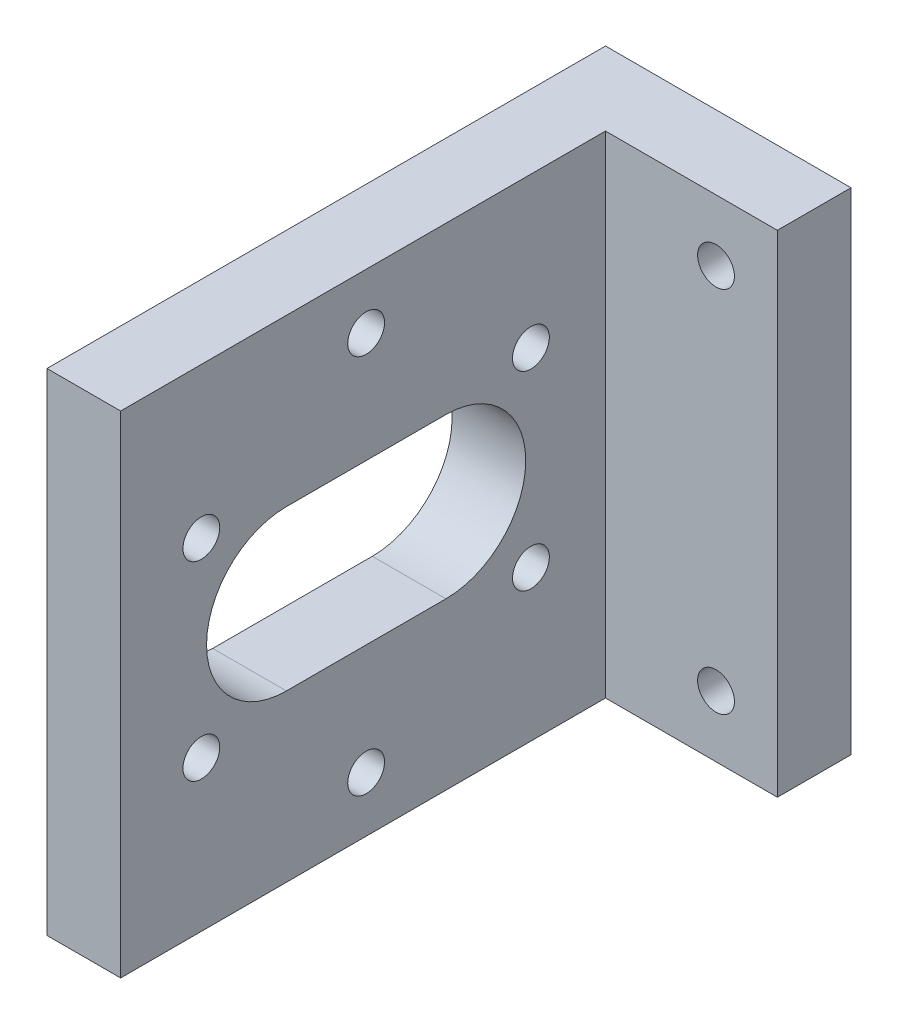
ISO-10303-21;
HEADER;
FILE_DESCRIPTION(('STEP AP214'),'2;1');
FILE_NAME('part.step','',(''),(''),'','','');
FILE_SCHEMA(('AUTOMOTIVE_DESIGN { 1 0 10303 214 1 1 1 1 }'));
ENDSEC;
DATA;
#1=APPLICATION_CONTEXT('core data for automotive mechanical design processes');
#2=APPLICATION_PROTOCOL_DEFINITION('international standard','automotive_design',2000,#1);
#3=PRODUCT_CONTEXT('',#1,'mechanical');
#4=PRODUCT('Part','Part','',(#3));
#5=PRODUCT_RELATED_PRODUCT_CATEGORY('part','',(#4));
#6=PRODUCT_DEFINITION_FORMATION('','',#4);
#7=PRODUCT_DEFINITION_CONTEXT('part definition',#1,'design');
#8=PRODUCT_DEFINITION('design','',#6,#7);
#9=PRODUCT_DEFINITION_SHAPE('','',#8);
#10=(LENGTH_UNIT() NAMED_UNIT(*) SI_UNIT(.MILLI.,.METRE.));
#11=(NAMED_UNIT(*) PLANE_ANGLE_UNIT() SI_UNIT($,.RADIAN.));
#12=(NAMED_UNIT(*) SI_UNIT($,.STERADIAN.) SOLID_ANGLE_UNIT());
#13=UNCERTAINTY_MEASURE_WITH_UNIT(LENGTH_MEASURE(1.E-05),#10,'distance_accuracy_value','');
#14=(GEOMETRIC_REPRESENTATION_CONTEXT(3) GLOBAL_UNCERTAINTY_ASSIGNED_CONTEXT((#13)) GLOBAL_UNIT_ASSIGNED_CONTEXT((#10,
#11,#12)) REPRESENTATION_CONTEXT('',''));
#15=CARTESIAN_POINT('',(0.,0.,0.));
#16=DIRECTION('',(0.,0.,1.));
#17=DIRECTION('',(1.,0.,0.));
#18=AXIS2_PLACEMENT_3D('',#15,#16,#17);
#19=CARTESIAN_POINT('',(0.,7.75,11.076606241341));
#20=DIRECTION('',(-1.,0.,0.));
#21=DIRECTION('',(0.,1.,0.));
#22=AXIS2_PLACEMENT_3D('',#19,#20,#21);
#23=CYLINDRICAL_SURFACE('',#22,1.5);
#24=DIRECTION('',(1.,0.,0.));
#25=VECTOR('',#24,1.);
#26=CARTESIAN_POINT('',(0.,9.25,11.076606241341));
#27=LINE('',#26,#25);
#28=CARTESIAN_POINT('',(0.,9.25,11.076606241341));
#29=VERTEX_POINT('',#28);
#30=CARTESIAN_POINT('',(1.,9.25,11.076606241341));
#31=VERTEX_POINT('',#30);
#32=EDGE_CURVE('E13',#29,#31,#27,.T.);
#33=ORIENTED_EDGE('',*,*,#32,.F.);
#34=ORIENTED_EDGE('',*,*,#32,.T.);
#35=CARTESIAN_POINT('',(1.,7.75,11.076606241341));
#36=DIRECTION('',(-1.,0.,0.));
#37=DIRECTION('',(0.,1.,0.));
#38=AXIS2_PLACEMENT_3D('',#35,#36,#37);
#39=CIRCLE('',#38,1.5);
#40=EDGE_CURVE('E311',#31,#31,#39,.T.);
#41=ORIENTED_EDGE('',*,*,#40,.F.);
#42=EDGE_LOOP('',(#33,#34,#41));
#43=FACE_BOUND('',#42,.T.);
#44=CARTESIAN_POINT('',(-5.,7.75,11.076606241341));
#45=DIRECTION('',(-1.,0.,0.));
#46=DIRECTION('',(0.,0.,1.));
#47=AXIS2_PLACEMENT_3D('',#44,#45,#46);
#48=CIRCLE('',#47,1.5);
#49=CARTESIAN_POINT('',(-5.,7.75,12.576606241341));
#50=VERTEX_POINT('',#49);
#51=EDGE_CURVE('E253',#50,#50,#48,.T.);
#52=ORIENTED_EDGE('',*,*,#51,.T.);
#53=EDGE_LOOP('',(#52));
#54=FACE_BOUND('',#53,.T.);
#55=ADVANCED_FACE('F60',(#43,#54),#23,.F.);
#56=CARTESIAN_POINT('',(0.,15.5,24.5));
#57=DIRECTION('',(-1.,0.,0.));
#58=DIRECTION('',(0.,1.,0.));
#59=AXIS2_PLACEMENT_3D('',#56,#57,#58);
#60=CYLINDRICAL_SURFACE('',#59,1.5);
#61=DIRECTION('',(1.,0.,0.));
#62=VECTOR('',#61,1.);
#63=CARTESIAN_POINT('',(0.,17.,24.5));
#64=LINE('',#63,#62);
#65=CARTESIAN_POINT('',(0.,17.,24.5));
#66=VERTEX_POINT('',#65);
#67=CARTESIAN_POINT('',(1.,17.,24.5));
#68=VERTEX_POINT('',#67);
#69=EDGE_CURVE('E69',#66,#68,#64,.T.);
#70=ORIENTED_EDGE('',*,*,#69,.F.);
#71=ORIENTED_EDGE('',*,*,#69,.T.);
#72=CARTESIAN_POINT('',(1.,15.5,24.5));
#73=DIRECTION('',(-1.,0.,0.));
#74=DIRECTION('',(0.,1.,0.));
#75=AXIS2_PLACEMENT_3D('',#72,#73,#74);
#76=CIRCLE('',#75,1.5);
#77=EDGE_CURVE('E320',#68,#68,#76,.T.);
#78=ORIENTED_EDGE('',*,*,#77,.F.);
#79=EDGE_LOOP('',(#70,#71,#78));
#80=FACE_BOUND('',#79,.T.);
#81=CARTESIAN_POINT('',(-5.,15.5,24.5));
#82=DIRECTION('',(-1.,0.,0.));
#83=DIRECTION('',(0.,0.,1.));
#84=AXIS2_PLACEMENT_3D('',#81,#82,#83);
#85=CIRCLE('',#84,1.5);
#86=CARTESIAN_POINT('',(-5.,15.5,26.));
#87=VERTEX_POINT('',#86);
#88=EDGE_CURVE('E256',#87,#87,#85,.T.);
#89=ORIENTED_EDGE('',*,*,#88,.T.);
#90=EDGE_LOOP('',(#89));
#91=FACE_BOUND('',#90,.T.);
#92=ADVANCED_FACE('F370',(#80,#91),#60,.F.);
#93=CARTESIAN_POINT('',(0.,6.5,18.));
#94=DIRECTION('',(0.,-1.,0.));
#95=DIRECTION('',(-1.,0.,0.));
#96=AXIS2_PLACEMENT_3D('',#93,#94,#95);
#97=PLANE('',#96);
#98=DIRECTION('',(1.,0.,0.));
#99=VECTOR('',#98,1.);
#100=CARTESIAN_POINT('',(0.,6.5,31.));
#101=LINE('',#100,#99);
#102=CARTESIAN_POINT('',(-5.,6.5,31.));
#103=VERTEX_POINT('',#102);
#104=CARTESIAN_POINT('',(1.,6.5,31.));
#105=VERTEX_POINT('',#104);
#106=EDGE_CURVE('E317',#103,#105,#101,.T.);
#107=ORIENTED_EDGE('',*,*,#106,.F.);
#108=DIRECTION('',(0.,0.,-1.));
#109=VECTOR('',#108,1.);
#110=CARTESIAN_POINT('',(-5.,6.5,18.));
#111=LINE('',#110,#109);
#112=CARTESIAN_POINT('',(-5.,6.5,18.));
#113=VERTEX_POINT('',#112);
#114=EDGE_CURVE('E268',#103,#113,#111,.T.);
#115=ORIENTED_EDGE('',*,*,#114,.T.);
#116=DIRECTION('',(1.,0.,0.));
#117=VECTOR('',#116,1.);
#118=CARTESIAN_POINT('',(0.,6.5,18.));
#119=LINE('',#118,#117);
#120=CARTESIAN_POINT('',(1.,6.5,18.));
#121=VERTEX_POINT('',#120);
#122=EDGE_CURVE('E285',#113,#121,#119,.T.);
#123=ORIENTED_EDGE('',*,*,#122,.T.);
#124=DIRECTION('',(0.,0.,1.));
#125=VECTOR('',#124,1.);
#126=CARTESIAN_POINT('',(1.,6.5,9.));
#127=LINE('',#126,#125);
#128=EDGE_CURVE('E290',#121,#105,#127,.T.);
#129=ORIENTED_EDGE('',*,*,#128,.T.);
#130=EDGE_LOOP('',(#107,#115,#123,#129));
#131=FACE_BOUND('',#130,.T.);
#132=ADVANCED_FACE('F376',(#131),#97,.T.);
#133=CARTESIAN_POINT('',(0.,7.75,37.923393758659));
#134=DIRECTION('',(-1.,0.,0.));
#135=DIRECTION('',(0.,1.,0.));
#136=AXIS2_PLACEMENT_3D('',#133,#134,#135);
#137=CYLINDRICAL_SURFACE('',#136,1.5);
#138=DIRECTION('',(1.,0.,0.));
#139=VECTOR('',#138,1.);
#140=CARTESIAN_POINT('',(0.,9.25,37.923393758659));
#141=LINE('',#140,#139);
#142=CARTESIAN_POINT('',(0.,9.25,37.923393758659));
#143=VERTEX_POINT('',#142);
#144=CARTESIAN_POINT('',(1.,9.25,37.923393758659));
#145=VERTEX_POINT('',#144);
#146=EDGE_CURVE('E335',#143,#145,#141,.T.);
#147=ORIENTED_EDGE('',*,*,#146,.F.);
#148=ORIENTED_EDGE('',*,*,#146,.T.);
#149=CARTESIAN_POINT('',(1.,7.75,37.923393758659));
#150=DIRECTION('',(-1.,0.,0.));
#151=DIRECTION('',(0.,1.,0.));
#152=AXIS2_PLACEMENT_3D('',#149,#150,#151);
#153=CIRCLE('',#152,1.5);
#154=EDGE_CURVE('E289',#145,#145,#153,.T.);
#155=ORIENTED_EDGE('',*,*,#154,.F.);
#156=EDGE_LOOP('',(#147,#148,#155));
#157=FACE_BOUND('',#156,.T.);
#158=CARTESIAN_POINT('',(-5.,7.75,37.923393758659));
#159=DIRECTION('',(-1.,0.,0.));
#160=DIRECTION('',(0.,0.,1.));
#161=AXIS2_PLACEMENT_3D('',#158,#159,#160);
#162=CIRCLE('',#161,1.5);
#163=CARTESIAN_POINT('',(-5.,7.75,39.423393758659));
#164=VERTEX_POINT('',#163);
#165=EDGE_CURVE('E259',#164,#164,#162,.T.);
#166=ORIENTED_EDGE('',*,*,#165,.T.);
#167=EDGE_LOOP('',(#166));
#168=FACE_BOUND('',#167,.T.);
#169=ADVANCED_FACE('F387',(#157,#168),#137,.F.);
#170=CARTESIAN_POINT('',(0.,-7.75,11.076606241341));
#171=DIRECTION('',(-1.,0.,0.));
#172=DIRECTION('',(0.,1.,0.));
#173=AXIS2_PLACEMENT_3D('',#170,#171,#172);
#174=CYLINDRICAL_SURFACE('',#173,1.5);
#175=DIRECTION('',(1.,0.,0.));
#176=VECTOR('',#175,1.);
#177=CARTESIAN_POINT('',(0.,-6.25,11.076606241341));
#178=LINE('',#177,#176);
#179=CARTESIAN_POINT('',(0.,-6.25,11.076606241341));
#180=VERTEX_POINT('',#179);
#181=CARTESIAN_POINT('',(1.,-6.25,11.076606241341));
#182=VERTEX_POINT('',#181);
#183=EDGE_CURVE('E333',#180,#182,#178,.T.);
#184=ORIENTED_EDGE('',*,*,#183,.F.);
#185=ORIENTED_EDGE('',*,*,#183,.T.);
#186=CARTESIAN_POINT('',(1.,-7.75,11.076606241341));
#187=DIRECTION('',(-1.,0.,0.));
#188=DIRECTION('',(0.,1.,0.));
#189=AXIS2_PLACEMENT_3D('',#186,#187,#188);
#190=CIRCLE('',#189,1.5);
#191=EDGE_CURVE('E307',#182,#182,#190,.T.);
#192=ORIENTED_EDGE('',*,*,#191,.F.);
#193=EDGE_LOOP('',(#184,#185,#192));
#194=FACE_BOUND('',#193,.T.);
#195=CARTESIAN_POINT('',(-5.,-7.75,11.076606241341));
#196=DIRECTION('',(-1.,0.,0.));
#197=DIRECTION('',(0.,0.,1.));
#198=AXIS2_PLACEMENT_3D('',#195,#196,#197);
#199=CIRCLE('',#198,1.5);
#200=CARTESIAN_POINT('',(-5.,-7.75,12.576606241341));
#201=VERTEX_POINT('',#200);
#202=EDGE_CURVE('E244',#201,#201,#199,.T.);
#203=ORIENTED_EDGE('',*,*,#202,.T.);
#204=EDGE_LOOP('',(#203));
#205=FACE_BOUND('',#204,.T.);
#206=ADVANCED_FACE('F390',(#194,#205),#174,.F.);
#207=CARTESIAN_POINT('',(0.,-15.5,24.5));
#208=DIRECTION('',(-1.,0.,0.));
#209=DIRECTION('',(0.,1.,0.));
#210=AXIS2_PLACEMENT_3D('',#207,#208,#209);
#211=CYLINDRICAL_SURFACE('',#210,1.5);
#212=DIRECTION('',(1.,0.,0.));
#213=VECTOR('',#212,1.);
#214=CARTESIAN_POINT('',(0.,-14.,24.5));
#215=LINE('',#214,#213);
#216=CARTESIAN_POINT('',(0.,-14.,24.5));
#217=VERTEX_POINT('',#216);
#218=CARTESIAN_POINT('',(1.,-14.,24.5));
#219=VERTEX_POINT('',#218);
#220=EDGE_CURVE('E64',#217,#219,#215,.T.);
#221=ORIENTED_EDGE('',*,*,#220,.F.);
#222=ORIENTED_EDGE('',*,*,#220,.T.);
#223=CARTESIAN_POINT('',(1.,-15.5,24.5));
#224=DIRECTION('',(-1.,0.,0.));
#225=DIRECTION('',(0.,1.,0.));
#226=AXIS2_PLACEMENT_3D('',#223,#224,#225);
#227=CIRCLE('',#226,1.5);
#228=EDGE_CURVE('E286',#219,#219,#227,.T.);
#229=ORIENTED_EDGE('',*,*,#228,.F.);
#230=EDGE_LOOP('',(#221,#222,#229));
#231=FACE_BOUND('',#230,.T.);
#232=CARTESIAN_POINT('',(-5.,-15.5,24.5));
#233=DIRECTION('',(-1.,0.,0.));
#234=DIRECTION('',(0.,0.,1.));
#235=AXIS2_PLACEMENT_3D('',#232,#233,#234);
#236=CIRCLE('',#235,1.5);
#237=CARTESIAN_POINT('',(-5.,-15.5,26.));
#238=VERTEX_POINT('',#237);
#239=EDGE_CURVE('E247',#238,#238,#236,.T.);
#240=ORIENTED_EDGE('',*,*,#239,.T.);
#241=EDGE_LOOP('',(#240));
#242=FACE_BOUND('',#241,.T.);
#243=ADVANCED_FACE('F62',(#231,#242),#211,.F.);
#244=CARTESIAN_POINT('',(0.,-7.75,37.923393758659));
#245=DIRECTION('',(-1.,0.,0.));
#246=DIRECTION('',(0.,1.,0.));
#247=AXIS2_PLACEMENT_3D('',#244,#245,#246);
#248=CYLINDRICAL_SURFACE('',#247,1.5);
#249=DIRECTION('',(1.,0.,0.));
#250=VECTOR('',#249,1.);
#251=CARTESIAN_POINT('',(0.,-6.25,37.923393758659));
#252=LINE('',#251,#250);
#253=CARTESIAN_POINT('',(0.,-6.25,37.923393758659));
#254=VERTEX_POINT('',#253);
#255=CARTESIAN_POINT('',(1.,-6.25,37.923393758659));
#256=VERTEX_POINT('',#255);
#257=EDGE_CURVE('E283',#254,#256,#252,.T.);
#258=ORIENTED_EDGE('',*,*,#257,.F.);
#259=ORIENTED_EDGE('',*,*,#257,.T.);
#260=CARTESIAN_POINT('',(1.,-7.75,37.923393758659));
#261=DIRECTION('',(-1.,0.,0.));
#262=DIRECTION('',(0.,1.,0.));
#263=AXIS2_PLACEMENT_3D('',#260,#261,#262);
#264=CIRCLE('',#263,1.5);
#265=EDGE_CURVE('E203',#256,#256,#264,.T.);
#266=ORIENTED_EDGE('',*,*,#265,.F.);
#267=EDGE_LOOP('',(#258,#259,#266));
#268=FACE_BOUND('',#267,.T.);
#269=CARTESIAN_POINT('',(-5.,-7.75,37.923393758659));
#270=DIRECTION('',(-1.,0.,0.));
#271=DIRECTION('',(0.,0.,1.));
#272=AXIS2_PLACEMENT_3D('',#269,#270,#271);
#273=CIRCLE('',#272,1.5);
#274=CARTESIAN_POINT('',(-5.,-7.75,39.423393758659));
#275=VERTEX_POINT('',#274);
#276=EDGE_CURVE('E250',#275,#275,#273,.T.);
#277=ORIENTED_EDGE('',*,*,#276,.T.);
#278=EDGE_LOOP('',(#277));
#279=FACE_BOUND('',#278,.T.);
#280=ADVANCED_FACE('F411',(#268,#279),#248,.F.);
#281=CARTESIAN_POINT('',(0.,0.,18.));
#282=DIRECTION('',(-1.,0.,0.));
#283=DIRECTION('',(0.,1.,0.));
#284=AXIS2_PLACEMENT_3D('',#281,#282,#283);
#285=CYLINDRICAL_SURFACE('',#284,6.5);
#286=ORIENTED_EDGE('',*,*,#122,.F.);
#287=CARTESIAN_POINT('',(-5.,0.,18.));
#288=DIRECTION('',(-1.,0.,0.));
#289=DIRECTION('',(0.,0.,1.));
#290=AXIS2_PLACEMENT_3D('',#287,#288,#289);
#291=CIRCLE('',#290,6.5);
#292=CARTESIAN_POINT('',(-5.,-6.5,18.));
#293=VERTEX_POINT('',#292);
#294=EDGE_CURVE('E265',#113,#293,#291,.T.);
#295=ORIENTED_EDGE('',*,*,#294,.T.);
#296=DIRECTION('',(1.,0.,0.));
#297=VECTOR('',#296,1.);
#298=CARTESIAN_POINT('',(0.,-6.5,18.));
#299=LINE('',#298,#297);
#300=CARTESIAN_POINT('',(1.,-6.5,18.));
#301=VERTEX_POINT('',#300);
#302=EDGE_CURVE('E300',#293,#301,#299,.T.);
#303=ORIENTED_EDGE('',*,*,#302,.T.);
#304=CARTESIAN_POINT('',(1.,0.,18.));
#305=DIRECTION('',(-1.,0.,0.));
#306=DIRECTION('',(0.,1.,0.));
#307=AXIS2_PLACEMENT_3D('',#304,#305,#306);
#308=CIRCLE('',#307,6.5);
#309=EDGE_CURVE('E293',#121,#301,#308,.T.);
#310=ORIENTED_EDGE('',*,*,#309,.F.);
#311=EDGE_LOOP('',(#286,#295,#303,#310));
#312=FACE_BOUND('',#311,.T.);
#313=ADVANCED_FACE('F406',(#312),#285,.F.);
#314=CARTESIAN_POINT('',(0.,-6.5,18.));
#315=DIRECTION('',(0.,-1.,0.));
#316=DIRECTION('',(-1.,0.,0.));
#317=AXIS2_PLACEMENT_3D('',#314,#315,#316);
#318=PLANE('',#317);
#319=DIRECTION('',(1.,0.,0.));
#320=VECTOR('',#319,1.);
#321=CARTESIAN_POINT('',(0.,-6.5,31.));
#322=LINE('',#321,#320);
#323=CARTESIAN_POINT('',(-5.,-6.5,31.));
#324=VERTEX_POINT('',#323);
#325=CARTESIAN_POINT('',(1.,-6.5,31.));
#326=VERTEX_POINT('',#325);
#327=EDGE_CURVE('E302',#324,#326,#322,.T.);
#328=ORIENTED_EDGE('',*,*,#327,.T.);
#329=DIRECTION('',(0.,0.,1.));
#330=VECTOR('',#329,1.);
#331=CARTESIAN_POINT('',(1.,-6.5,9.));
#332=LINE('',#331,#330);
#333=EDGE_CURVE('E326',#301,#326,#332,.T.);
#334=ORIENTED_EDGE('',*,*,#333,.F.);
#335=ORIENTED_EDGE('',*,*,#302,.F.);
#336=DIRECTION('',(0.,0.,1.));
#337=VECTOR('',#336,1.);
#338=CARTESIAN_POINT('',(-5.,-6.5,31.));
#339=LINE('',#338,#337);
#340=EDGE_CURVE('E262',#293,#324,#339,.T.);
#341=ORIENTED_EDGE('',*,*,#340,.T.);
#342=EDGE_LOOP('',(#328,#334,#335,#341));
#343=FACE_BOUND('',#342,.T.);
#344=ADVANCED_FACE('F397',(#343),#318,.F.);
#345=CARTESIAN_POINT('',(0.,0.,31.));
#346=DIRECTION('',(-1.,0.,0.));
#347=DIRECTION('',(0.,1.,0.));
#348=AXIS2_PLACEMENT_3D('',#345,#346,#347);
#349=CYLINDRICAL_SURFACE('',#348,6.5);
#350=CARTESIAN_POINT('',(-5.,0.,31.));
#351=DIRECTION('',(-1.,0.,0.));
#352=DIRECTION('',(0.,0.,1.));
#353=AXIS2_PLACEMENT_3D('',#350,#351,#352);
#354=CIRCLE('',#353,6.5);
#355=EDGE_CURVE('E271',#324,#103,#354,.T.);
#356=ORIENTED_EDGE('',*,*,#355,.T.);
#357=ORIENTED_EDGE('',*,*,#106,.T.);
#358=CARTESIAN_POINT('',(1.,0.,31.));
#359=DIRECTION('',(-1.,0.,0.));
#360=DIRECTION('',(0.,1.,0.));
#361=AXIS2_PLACEMENT_3D('',#358,#359,#360);
#362=CIRCLE('',#361,6.5);
#363=EDGE_CURVE('E294',#326,#105,#362,.T.);
#364=ORIENTED_EDGE('',*,*,#363,.F.);
#365=ORIENTED_EDGE('',*,*,#327,.F.);
#366=EDGE_LOOP('',(#356,#357,#364,#365));
#367=FACE_BOUND('',#366,.T.);
#368=ADVANCED_FACE('F394',(#367),#349,.F.);
#369=CARTESIAN_POINT('',(10.,15.000000000005,0.));
#370=DIRECTION('',(0.,0.,1.));
#371=DIRECTION('',(1.,0.,0.));
#372=AXIS2_PLACEMENT_3D('',#369,#370,#371);
#373=CYLINDRICAL_SURFACE('',#372,1.5);
#374=DIRECTION('',(0.,0.,-1.));
#375=VECTOR('',#374,1.);
#376=CARTESIAN_POINT('',(11.5,15.000000000005,0.));
#377=LINE('',#376,#375);
#378=CARTESIAN_POINT('',(11.5,15.000000000005,0.));
#379=VERTEX_POINT('',#378);
#380=CARTESIAN_POINT('',(11.5,15.000000000005,-1.));
#381=VERTEX_POINT('',#380);
#382=EDGE_CURVE('E310',#379,#381,#377,.T.);
#383=ORIENTED_EDGE('',*,*,#382,.F.);
#384=ORIENTED_EDGE('',*,*,#382,.T.);
#385=CARTESIAN_POINT('',(10.,15.000000000005,-1.));
#386=DIRECTION('',(0.,0.,1.));
#387=DIRECTION('',(1.,0.,0.));
#388=AXIS2_PLACEMENT_3D('',#385,#386,#387);
#389=CIRCLE('',#388,1.5);
#390=EDGE_CURVE('E298',#381,#381,#389,.T.);
#391=ORIENTED_EDGE('',*,*,#390,.F.);
#392=EDGE_LOOP('',(#383,#384,#391));
#393=FACE_BOUND('',#392,.T.);
#394=CARTESIAN_POINT('',(10.,15.000000000005,5.));
#395=DIRECTION('',(0.,0.,1.));
#396=DIRECTION('',(1.,0.,0.));
#397=AXIS2_PLACEMENT_3D('',#394,#395,#396);
#398=CIRCLE('',#397,1.5);
#399=CARTESIAN_POINT('',(11.5,15.000000000005,5.));
#400=VERTEX_POINT('',#399);
#401=EDGE_CURVE('E228',#400,#400,#398,.T.);
#402=ORIENTED_EDGE('',*,*,#401,.T.);
#403=EDGE_LOOP('',(#402));
#404=FACE_BOUND('',#403,.T.);
#405=ADVANCED_FACE('F382',(#393,#404),#373,.F.);
#406=CARTESIAN_POINT('',(10.,-14.99999999999,0.));
#407=DIRECTION('',(0.,0.,1.));
#408=DIRECTION('',(1.,0.,0.));
#409=AXIS2_PLACEMENT_3D('',#406,#407,#408);
#410=CYLINDRICAL_SURFACE('',#409,1.5);
#411=DIRECTION('',(0.,0.,-1.));
#412=VECTOR('',#411,1.);
#413=CARTESIAN_POINT('',(11.5,-14.99999999999,0.));
#414=LINE('',#413,#412);
#415=CARTESIAN_POINT('',(11.5,-14.99999999999,0.));
#416=VERTEX_POINT('',#415);
#417=CARTESIAN_POINT('',(11.5,-14.99999999999,-1.));
#418=VERTEX_POINT('',#417);
#419=EDGE_CURVE('E308',#416,#418,#414,.T.);
#420=ORIENTED_EDGE('',*,*,#419,.F.);
#421=ORIENTED_EDGE('',*,*,#419,.T.);
#422=CARTESIAN_POINT('',(10.,-14.99999999999,-1.));
#423=DIRECTION('',(0.,0.,1.));
#424=DIRECTION('',(1.,0.,0.));
#425=AXIS2_PLACEMENT_3D('',#422,#423,#424);
#426=CIRCLE('',#425,1.5);
#427=EDGE_CURVE('E295',#418,#418,#426,.T.);
#428=ORIENTED_EDGE('',*,*,#427,.F.);
#429=EDGE_LOOP('',(#420,#421,#428));
#430=FACE_BOUND('',#429,.T.);
#431=CARTESIAN_POINT('',(10.,-14.99999999999,5.));
#432=DIRECTION('',(0.,0.,1.));
#433=DIRECTION('',(1.,0.,0.));
#434=AXIS2_PLACEMENT_3D('',#431,#432,#433);
#435=CIRCLE('',#434,1.5);
#436=CARTESIAN_POINT('',(11.5,-14.99999999999,5.));
#437=VERTEX_POINT('',#436);
#438=EDGE_CURVE('E227',#437,#437,#435,.T.);
#439=ORIENTED_EDGE('',*,*,#438,.T.);
#440=EDGE_LOOP('',(#439));
#441=FACE_BOUND('',#440,.T.);
#442=ADVANCED_FACE('F399',(#430,#441),#410,.F.);
#443=CARTESIAN_POINT('',(1.,-20.,0.));
#444=DIRECTION('',(-1.,0.,0.));
#445=DIRECTION('',(0.,0.,1.));
#446=AXIS2_PLACEMENT_3D('',#443,#444,#445);
#447=PLANE('',#446);
#448=ORIENTED_EDGE('',*,*,#40,.T.);
#449=EDGE_LOOP('',(#448));
#450=FACE_BOUND('',#449,.T.);
#451=ORIENTED_EDGE('',*,*,#77,.T.);
#452=EDGE_LOOP('',(#451));
#453=FACE_BOUND('',#452,.T.);
#454=ORIENTED_EDGE('',*,*,#191,.T.);
#455=EDGE_LOOP('',(#454));
#456=FACE_BOUND('',#455,.T.);
#457=ORIENTED_EDGE('',*,*,#333,.T.);
#458=ORIENTED_EDGE('',*,*,#363,.T.);
#459=ORIENTED_EDGE('',*,*,#128,.F.);
#460=ORIENTED_EDGE('',*,*,#309,.T.);
#461=EDGE_LOOP('',(#457,#458,#459,#460));
#462=FACE_BOUND('',#461,.T.);
#463=ORIENTED_EDGE('',*,*,#154,.T.);
#464=EDGE_LOOP('',(#463));
#465=FACE_BOUND('',#464,.T.);
#466=ORIENTED_EDGE('',*,*,#228,.T.);
#467=EDGE_LOOP('',(#466));
#468=FACE_BOUND('',#467,.T.);
#469=ORIENTED_EDGE('',*,*,#265,.T.);
#470=EDGE_LOOP('',(#469));
#471=FACE_BOUND('',#470,.T.);
#472=DIRECTION('',(0.,0.,1.));
#473=VECTOR('',#472,1.);
#474=CARTESIAN_POINT('',(1.,-20.,0.));
#475=LINE('',#474,#473);
#476=CARTESIAN_POINT('',(1.,-20.,5.));
#477=VERTEX_POINT('',#476);
#478=CARTESIAN_POINT('',(1.,-20.,44.5));
#479=VERTEX_POINT('',#478);
#480=EDGE_CURVE('E82',#477,#479,#475,.T.);
#481=ORIENTED_EDGE('',*,*,#480,.F.);
#482=DIRECTION('',(0.,-1.,0.));
#483=VECTOR('',#482,1.);
#484=CARTESIAN_POINT('',(1.,19.999999999998,5.));
#485=LINE('',#484,#483);
#486=CARTESIAN_POINT('',(1.,19.999999999998,5.));
#487=VERTEX_POINT('',#486);
#488=EDGE_CURVE('E77',#487,#477,#485,.T.);
#489=ORIENTED_EDGE('',*,*,#488,.F.);
#490=DIRECTION('',(0.,0.,1.));
#491=VECTOR('',#490,1.);
#492=CARTESIAN_POINT('',(1.,19.999999999998,0.));
#493=LINE('',#492,#491);
#494=CARTESIAN_POINT('',(1.,20.,44.5));
#495=VERTEX_POINT('',#494);
#496=EDGE_CURVE('E194',#487,#495,#493,.T.);
#497=ORIENTED_EDGE('',*,*,#496,.T.);
#498=DIRECTION('',(0.,-1.,0.));
#499=VECTOR('',#498,1.);
#500=CARTESIAN_POINT('',(1.,0.,44.5));
#501=LINE('',#500,#499);
#502=EDGE_CURVE('E197',#495,#479,#501,.T.);
#503=ORIENTED_EDGE('',*,*,#502,.T.);
#504=EDGE_LOOP('',(#481,#489,#497,#503));
#505=FACE_BOUND('',#504,.T.);
#506=ADVANCED_FACE('F196',(#450,#453,#456,#462,#465,#468,#471,#505),#447,.F.);
#507=CARTESIAN_POINT('',(41.,20.000000000005,0.));
#508=DIRECTION('',(0.,1.,0.));
#509=DIRECTION('',(1.,0.,0.));
#510=AXIS2_PLACEMENT_3D('',#507,#508,#509);
#511=PLANE('',#510);
#512=DIRECTION('',(0.,0.,-1.));
#513=VECTOR('',#512,1.);
#514=CARTESIAN_POINT('',(15.,19.999999999998,53.3792402008323));
#515=LINE('',#514,#513);
#516=CARTESIAN_POINT('',(15.,19.999999999998,5.));
#517=VERTEX_POINT('',#516);
#518=CARTESIAN_POINT('',(15.,20.000000000005,-1.));
#519=VERTEX_POINT('',#518);
#520=EDGE_CURVE('E240',#517,#519,#515,.T.);
#521=ORIENTED_EDGE('',*,*,#520,.T.);
#522=DIRECTION('',(-1.,0.,0.));
#523=VECTOR('',#522,1.);
#524=CARTESIAN_POINT('',(41.,20.000000000005,-1.));
#525=LINE('',#524,#523);
#526=CARTESIAN_POINT('',(-5.,20.000000000005,-1.));
#527=VERTEX_POINT('',#526);
#528=EDGE_CURVE('E299',#519,#527,#525,.T.);
#529=ORIENTED_EDGE('',*,*,#528,.T.);
#530=DIRECTION('',(0.,4.00027233560252E-12,-1.));
#531=VECTOR('',#530,1.);
#532=CARTESIAN_POINT('',(-5.,20.000000000001,0.));
#533=LINE('',#532,#531);
#534=CARTESIAN_POINT('',(-5.,20.,44.5));
#535=VERTEX_POINT('',#534);
#536=EDGE_CURVE('E218',#535,#527,#533,.T.);
#537=ORIENTED_EDGE('',*,*,#536,.F.);
#538=DIRECTION('',(-1.,0.,0.));
#539=VECTOR('',#538,1.);
#540=CARTESIAN_POINT('',(29.2842712474619,20.,44.5));
#541=LINE('',#540,#539);
#542=EDGE_CURVE('E210',#495,#535,#541,.T.);
#543=ORIENTED_EDGE('',*,*,#542,.F.);
#544=ORIENTED_EDGE('',*,*,#496,.F.);
#545=DIRECTION('',(-1.,0.,0.));
#546=VECTOR('',#545,1.);
#547=CARTESIAN_POINT('',(15.,19.999999999998,5.));
#548=LINE('',#547,#546);
#549=EDGE_CURVE('E238',#517,#487,#548,.T.);
#550=ORIENTED_EDGE('',*,*,#549,.F.);
#551=EDGE_LOOP('',(#521,#529,#537,#543,#544,#550));
#552=FACE_BOUND('',#551,.T.);
#553=DIRECTION('',(-1.,0.,0.));
#554=VECTOR('',#553,1.);
#555=CARTESIAN_POINT('',(41.,20.000000000005,0.));
#556=LINE('',#555,#554);
#557=CARTESIAN_POINT('',(1.,19.999999999998,0.));
#558=VERTEX_POINT('',#557);
#559=CARTESIAN_POINT('',(0.,20.000000000001,0.));
#560=VERTEX_POINT('',#559);
#561=EDGE_CURVE('E204',#558,#560,#556,.T.);
#562=ORIENTED_EDGE('',*,*,#561,.F.);
#563=ORIENTED_EDGE('',*,*,#561,.T.);
#564=EDGE_LOOP('',(#562,#563));
#565=FACE_BOUND('',#564,.T.);
#566=ADVANCED_FACE('F215',(#552,#565),#511,.T.);
#567=CARTESIAN_POINT('',(20.5,4.64783E-12,-1.));
#568=DIRECTION('',(0.,0.,1.));
#569=DIRECTION('',(1.,0.,0.));
#570=AXIS2_PLACEMENT_3D('',#567,#568,#569);
#571=PLANE('',#570);
#572=ORIENTED_EDGE('',*,*,#390,.T.);
#573=EDGE_LOOP('',(#572));
#574=FACE_BOUND('',#573,.T.);
#575=ORIENTED_EDGE('',*,*,#427,.T.);
#576=EDGE_LOOP('',(#575));
#577=FACE_BOUND('',#576,.T.);
#578=ORIENTED_EDGE('',*,*,#528,.F.);
#579=DIRECTION('',(0.,-1.,0.));
#580=VECTOR('',#579,1.);
#581=CARTESIAN_POINT('',(15.,4.64735295104411E-12,-1.));
#582=LINE('',#581,#580);
#583=CARTESIAN_POINT('',(15.,-20.,-1.));
#584=VERTEX_POINT('',#583);
#585=EDGE_CURVE('E213',#519,#584,#582,.T.);
#586=ORIENTED_EDGE('',*,*,#585,.T.);
#587=DIRECTION('',(1.,0.,0.));
#588=VECTOR('',#587,1.);
#589=CARTESIAN_POINT('',(0.,-19.99999999999,-1.));
#590=LINE('',#589,#588);
#591=CARTESIAN_POINT('',(-5.,-19.99999999999,-1.));
#592=VERTEX_POINT('',#591);
#593=EDGE_CURVE('E280',#592,#584,#590,.T.);
#594=ORIENTED_EDGE('',*,*,#593,.F.);
#595=DIRECTION('',(0.,-1.,0.));
#596=VECTOR('',#595,1.);
#597=CARTESIAN_POINT('',(-5.,20.000000000005,-1.));
#598=LINE('',#597,#596);
#599=EDGE_CURVE('E274',#527,#592,#598,.T.);
#600=ORIENTED_EDGE('',*,*,#599,.F.);
#601=EDGE_LOOP('',(#578,#586,#594,#600));
#602=FACE_BOUND('',#601,.T.);
#603=ADVANCED_FACE('F347',(#574,#577,#602),#571,.F.);
#604=CARTESIAN_POINT('',(0.,-19.99999999999,0.));
#605=DIRECTION('',(0.,-1.,0.));
#606=DIRECTION('',(0.,0.,-1.));
#607=AXIS2_PLACEMENT_3D('',#604,#605,#606);
#608=PLANE('',#607);
#609=ORIENTED_EDGE('',*,*,#593,.T.);
#610=DIRECTION('',(0.,0.,-1.));
#611=VECTOR('',#610,1.);
#612=CARTESIAN_POINT('',(15.,-20.,53.3792402008323));
#613=LINE('',#612,#611);
#614=CARTESIAN_POINT('',(15.,-20.,5.));
#615=VERTEX_POINT('',#614);
#616=EDGE_CURVE('E242',#615,#584,#613,.T.);
#617=ORIENTED_EDGE('',*,*,#616,.F.);
#618=DIRECTION('',(1.,0.,0.));
#619=VECTOR('',#618,1.);
#620=CARTESIAN_POINT('',(1.,-20.,5.));
#621=LINE('',#620,#619);
#622=EDGE_CURVE('E234',#477,#615,#621,.T.);
#623=ORIENTED_EDGE('',*,*,#622,.F.);
#624=ORIENTED_EDGE('',*,*,#480,.T.);
#625=DIRECTION('',(-1.,0.,0.));
#626=VECTOR('',#625,1.);
#627=CARTESIAN_POINT('',(29.2842712474619,-20.,44.5));
#628=LINE('',#627,#626);
#629=CARTESIAN_POINT('',(-5.,-20.,44.5));
#630=VERTEX_POINT('',#629);
#631=EDGE_CURVE('E212',#479,#630,#628,.T.);
#632=ORIENTED_EDGE('',*,*,#631,.T.);
#633=DIRECTION('',(0.,-4.08261859693154E-13,1.));
#634=VECTOR('',#633,1.);
#635=CARTESIAN_POINT('',(-5.,-19.99999999999,0.));
#636=LINE('',#635,#634);
#637=EDGE_CURVE('E278',#592,#630,#636,.T.);
#638=ORIENTED_EDGE('',*,*,#637,.F.);
#639=EDGE_LOOP('',(#609,#617,#623,#624,#632,#638));
#640=FACE_BOUND('',#639,.T.);
#641=DIRECTION('',(1.,0.,0.));
#642=VECTOR('',#641,1.);
#643=CARTESIAN_POINT('',(0.,-19.99999999999,0.));
#644=LINE('',#643,#642);
#645=CARTESIAN_POINT('',(0.,-19.99999999999,0.));
#646=VERTEX_POINT('',#645);
#647=CARTESIAN_POINT('',(1.,-20.,0.));
#648=VERTEX_POINT('',#647);
#649=EDGE_CURVE('E314',#646,#648,#644,.T.);
#650=ORIENTED_EDGE('',*,*,#649,.F.);
#651=ORIENTED_EDGE('',*,*,#649,.T.);
#652=EDGE_LOOP('',(#650,#651));
#653=FACE_BOUND('',#652,.T.);
#654=ADVANCED_FACE('F352',(#640,#653),#608,.T.);
#655=CARTESIAN_POINT('',(-5.,-20.,0.));
#656=DIRECTION('',(-1.,0.,0.));
#657=DIRECTION('',(0.,0.,1.));
#658=AXIS2_PLACEMENT_3D('',#655,#656,#657);
#659=PLANE('',#658);
#660=ORIENTED_EDGE('',*,*,#202,.F.);
#661=EDGE_LOOP('',(#660));
#662=FACE_BOUND('',#661,.T.);
#663=ORIENTED_EDGE('',*,*,#239,.F.);
#664=EDGE_LOOP('',(#663));
#665=FACE_BOUND('',#664,.T.);
#666=ORIENTED_EDGE('',*,*,#276,.F.);
#667=EDGE_LOOP('',(#666));
#668=FACE_BOUND('',#667,.T.);
#669=ORIENTED_EDGE('',*,*,#51,.F.);
#670=EDGE_LOOP('',(#669));
#671=FACE_BOUND('',#670,.T.);
#672=ORIENTED_EDGE('',*,*,#88,.F.);
#673=EDGE_LOOP('',(#672));
#674=FACE_BOUND('',#673,.T.);
#675=ORIENTED_EDGE('',*,*,#165,.F.);
#676=EDGE_LOOP('',(#675));
#677=FACE_BOUND('',#676,.T.);
#678=ORIENTED_EDGE('',*,*,#355,.F.);
#679=ORIENTED_EDGE('',*,*,#340,.F.);
#680=ORIENTED_EDGE('',*,*,#294,.F.);
#681=ORIENTED_EDGE('',*,*,#114,.F.);
#682=EDGE_LOOP('',(#678,#679,#680,#681));
#683=FACE_BOUND('',#682,.T.);
#684=ORIENTED_EDGE('',*,*,#599,.T.);
#685=ORIENTED_EDGE('',*,*,#637,.T.);
#686=DIRECTION('',(0.,1.,0.));
#687=VECTOR('',#686,1.);
#688=CARTESIAN_POINT('',(-5.,0.,44.5));
#689=LINE('',#688,#687);
#690=EDGE_CURVE('E220',#630,#535,#689,.T.);
#691=ORIENTED_EDGE('',*,*,#690,.T.);
#692=ORIENTED_EDGE('',*,*,#536,.T.);
#693=EDGE_LOOP('',(#684,#685,#691,#692));
#694=FACE_BOUND('',#693,.T.);
#695=ADVANCED_FACE('F350',(#662,#665,#668,#671,#674,#677,#683,#694),#659,.T.);
#696=CARTESIAN_POINT('',(15.,19.999999999998,53.3792402008323));
#697=DIRECTION('',(-1.,0.,0.));
#698=DIRECTION('',(0.,-1.,0.));
#699=AXIS2_PLACEMENT_3D('',#696,#697,#698);
#700=PLANE('',#699);
#701=DIRECTION('',(0.,1.,0.));
#702=VECTOR('',#701,1.);
#703=CARTESIAN_POINT('',(15.,19.999999999998,5.));
#704=LINE('',#703,#702);
#705=EDGE_CURVE('E231',#615,#517,#704,.T.);
#706=ORIENTED_EDGE('',*,*,#705,.F.);
#707=ORIENTED_EDGE('',*,*,#616,.T.);
#708=ORIENTED_EDGE('',*,*,#585,.F.);
#709=ORIENTED_EDGE('',*,*,#520,.F.);
#710=EDGE_LOOP('',(#706,#707,#708,#709));
#711=FACE_BOUND('',#710,.T.);
#712=ADVANCED_FACE('F358',(#711),#700,.F.);
#713=CARTESIAN_POINT('',(20.5,4.64783E-12,5.));
#714=DIRECTION('',(0.,0.,1.));
#715=DIRECTION('',(1.,0.,0.));
#716=AXIS2_PLACEMENT_3D('',#713,#714,#715);
#717=PLANE('',#716);
#718=ORIENTED_EDGE('',*,*,#438,.F.);
#719=EDGE_LOOP('',(#718));
#720=FACE_BOUND('',#719,.T.);
#721=ORIENTED_EDGE('',*,*,#401,.F.);
#722=EDGE_LOOP('',(#721));
#723=FACE_BOUND('',#722,.T.);
#724=ORIENTED_EDGE('',*,*,#705,.T.);
#725=ORIENTED_EDGE('',*,*,#549,.T.);
#726=ORIENTED_EDGE('',*,*,#488,.T.);
#727=ORIENTED_EDGE('',*,*,#622,.T.);
#728=EDGE_LOOP('',(#724,#725,#726,#727));
#729=FACE_BOUND('',#728,.T.);
#730=ADVANCED_FACE('F356',(#720,#723,#729),#717,.T.);
#731=CARTESIAN_POINT('',(29.2842712474619,0.,44.5));
#732=DIRECTION('',(0.,0.,1.));
#733=DIRECTION('',(1.,0.,0.));
#734=AXIS2_PLACEMENT_3D('',#731,#732,#733);
#735=PLANE('',#734);
#736=ORIENTED_EDGE('',*,*,#502,.F.);
#737=ORIENTED_EDGE('',*,*,#542,.T.);
#738=ORIENTED_EDGE('',*,*,#690,.F.);
#739=ORIENTED_EDGE('',*,*,#631,.F.);
#740=EDGE_LOOP('',(#736,#737,#738,#739));
#741=FACE_BOUND('',#740,.T.);
#742=ADVANCED_FACE('F208',(#741),#735,.T.);
#743=CLOSED_SHELL('',(#55,#92,#132,#169,#206,#243,#280,#313,#344,#368,#405,#442,#506,#566,#603,
#654,#695,#712,#730,#742));
#744=MANIFOLD_SOLID_BREP('B2',#743);
#745=ADVANCED_BREP_SHAPE_REPRESENTATION('',(#18,#744),#14);
#746=SHAPE_DEFINITION_REPRESENTATION(#9,#745);
ENDSEC;
END-ISO-10303-21;
